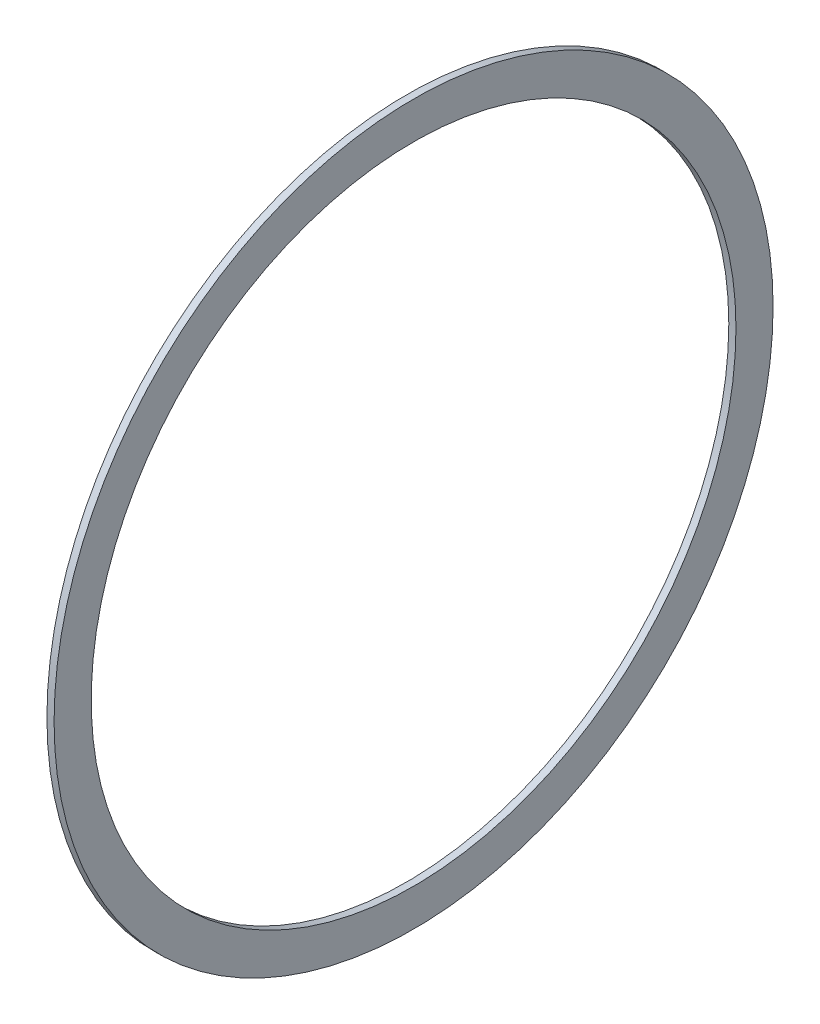
ISO-10303-21;
HEADER;
FILE_DESCRIPTION(('STEP AP214'),'2;1');
FILE_NAME('part.step','',(''),(''),'','','');
FILE_SCHEMA(('AUTOMOTIVE_DESIGN { 1 0 10303 214 1 1 1 1 }'));
ENDSEC;
DATA;
#1=APPLICATION_CONTEXT('core data for automotive mechanical design processes');
#2=APPLICATION_PROTOCOL_DEFINITION('international standard','automotive_design',2000,#1);
#3=PRODUCT_CONTEXT('',#1,'mechanical');
#4=PRODUCT('Part','Part','',(#3));
#5=PRODUCT_RELATED_PRODUCT_CATEGORY('part','',(#4));
#6=PRODUCT_DEFINITION_FORMATION('','',#4);
#7=PRODUCT_DEFINITION_CONTEXT('part definition',#1,'design');
#8=PRODUCT_DEFINITION('design','',#6,#7);
#9=PRODUCT_DEFINITION_SHAPE('','',#8);
#10=(LENGTH_UNIT() NAMED_UNIT(*) SI_UNIT(.MILLI.,.METRE.));
#11=(NAMED_UNIT(*) PLANE_ANGLE_UNIT() SI_UNIT($,.RADIAN.));
#12=(NAMED_UNIT(*) SI_UNIT($,.STERADIAN.) SOLID_ANGLE_UNIT());
#13=UNCERTAINTY_MEASURE_WITH_UNIT(LENGTH_MEASURE(1.E-05),#10,'distance_accuracy_value','');
#14=(GEOMETRIC_REPRESENTATION_CONTEXT(3) GLOBAL_UNCERTAINTY_ASSIGNED_CONTEXT((#13)) GLOBAL_UNIT_ASSIGNED_CONTEXT((#10,
#11,#12)) REPRESENTATION_CONTEXT('',''));
#15=CARTESIAN_POINT('',(0.,0.,0.));
#16=DIRECTION('',(0.,0.,1.));
#17=DIRECTION('',(1.,0.,0.));
#18=AXIS2_PLACEMENT_3D('',#15,#16,#17);
#19=CARTESIAN_POINT('',(1.51892,0.,0.));
#20=DIRECTION('',(1.,0.,0.));
#21=DIRECTION('',(0.,0.,-1.));
#22=AXIS2_PLACEMENT_3D('',#19,#20,#21);
#23=PLANE('',#22);
#24=CARTESIAN_POINT('',(1.51892,0.,0.));
#25=DIRECTION('',(1.,0.,0.));
#26=DIRECTION('',(0.,0.,-1.));
#27=AXIS2_PLACEMENT_3D('',#24,#25,#26);
#28=CIRCLE('',#27,76.2);
#29=CARTESIAN_POINT('',(1.51892,0.,-76.2));
#30=VERTEX_POINT('',#29);
#31=EDGE_CURVE('E10',#30,#30,#28,.T.);
#32=ORIENTED_EDGE('',*,*,#31,.T.);
#33=EDGE_LOOP('',(#32));
#34=FACE_BOUND('',#33,.T.);
#35=CARTESIAN_POINT('',(1.51892,0.,0.));
#36=DIRECTION('',(1.,0.,0.));
#37=DIRECTION('',(0.,0.,-1.));
#38=AXIS2_PLACEMENT_3D('',#35,#36,#37);
#39=CIRCLE('',#38,68.33108);
#40=CARTESIAN_POINT('',(1.51892,0.,-68.33108));
#41=VERTEX_POINT('',#40);
#42=EDGE_CURVE('E54',#41,#41,#39,.T.);
#43=ORIENTED_EDGE('',*,*,#42,.F.);
#44=EDGE_LOOP('',(#43));
#45=FACE_BOUND('',#44,.T.);
#46=ADVANCED_FACE('F41',(#34,#45),#23,.T.);
#47=CARTESIAN_POINT('',(0.,0.,0.));
#48=DIRECTION('',(1.,0.,0.));
#49=DIRECTION('',(0.,0.,-1.));
#50=AXIS2_PLACEMENT_3D('',#47,#48,#49);
#51=PLANE('',#50);
#52=CARTESIAN_POINT('',(0.,0.,0.));
#53=DIRECTION('',(1.,0.,0.));
#54=DIRECTION('',(0.,0.,-1.));
#55=AXIS2_PLACEMENT_3D('',#52,#53,#54);
#56=CIRCLE('',#55,76.2);
#57=CARTESIAN_POINT('',(0.,0.,-76.2));
#58=VERTEX_POINT('',#57);
#59=EDGE_CURVE('E45',#58,#58,#56,.T.);
#60=ORIENTED_EDGE('',*,*,#59,.F.);
#61=EDGE_LOOP('',(#60));
#62=FACE_BOUND('',#61,.T.);
#63=CARTESIAN_POINT('',(0.,0.,0.));
#64=DIRECTION('',(1.,0.,0.));
#65=DIRECTION('',(0.,0.,-1.));
#66=AXIS2_PLACEMENT_3D('',#63,#64,#65);
#67=CIRCLE('',#66,68.33108);
#68=CARTESIAN_POINT('',(0.,0.,-68.33108));
#69=VERTEX_POINT('',#68);
#70=EDGE_CURVE('E56',#69,#69,#67,.T.);
#71=ORIENTED_EDGE('',*,*,#70,.T.);
#72=EDGE_LOOP('',(#71));
#73=FACE_BOUND('',#72,.T.);
#74=ADVANCED_FACE('F68',(#62,#73),#51,.F.);
#75=CARTESIAN_POINT('',(1.51892,0.,0.));
#76=DIRECTION('',(-1.,0.,0.));
#77=DIRECTION('',(0.,0.,1.));
#78=AXIS2_PLACEMENT_3D('',#75,#76,#77);
#79=CYLINDRICAL_SURFACE('',#78,76.2);
#80=ORIENTED_EDGE('',*,*,#31,.F.);
#81=EDGE_LOOP('',(#80));
#82=FACE_BOUND('',#81,.T.);
#83=ORIENTED_EDGE('',*,*,#59,.T.);
#84=EDGE_LOOP('',(#83));
#85=FACE_BOUND('',#84,.T.);
#86=ADVANCED_FACE('F43',(#82,#85),#79,.T.);
#87=CARTESIAN_POINT('',(1.51892,0.,0.));
#88=DIRECTION('',(-1.,0.,0.));
#89=DIRECTION('',(0.,0.,1.));
#90=AXIS2_PLACEMENT_3D('',#87,#88,#89);
#91=CYLINDRICAL_SURFACE('',#90,68.33108);
#92=ORIENTED_EDGE('',*,*,#42,.T.);
#93=EDGE_LOOP('',(#92));
#94=FACE_BOUND('',#93,.T.);
#95=ORIENTED_EDGE('',*,*,#70,.F.);
#96=EDGE_LOOP('',(#95));
#97=FACE_BOUND('',#96,.T.);
#98=ADVANCED_FACE('F64',(#94,#97),#91,.F.);
#99=CLOSED_SHELL('',(#46,#74,#86,#98));
#100=MANIFOLD_SOLID_BREP('B2',#99);
#101=ADVANCED_BREP_SHAPE_REPRESENTATION('',(#18,#100),#14);
#102=SHAPE_DEFINITION_REPRESENTATION(#9,#101);
ENDSEC;
END-ISO-10303-21;
